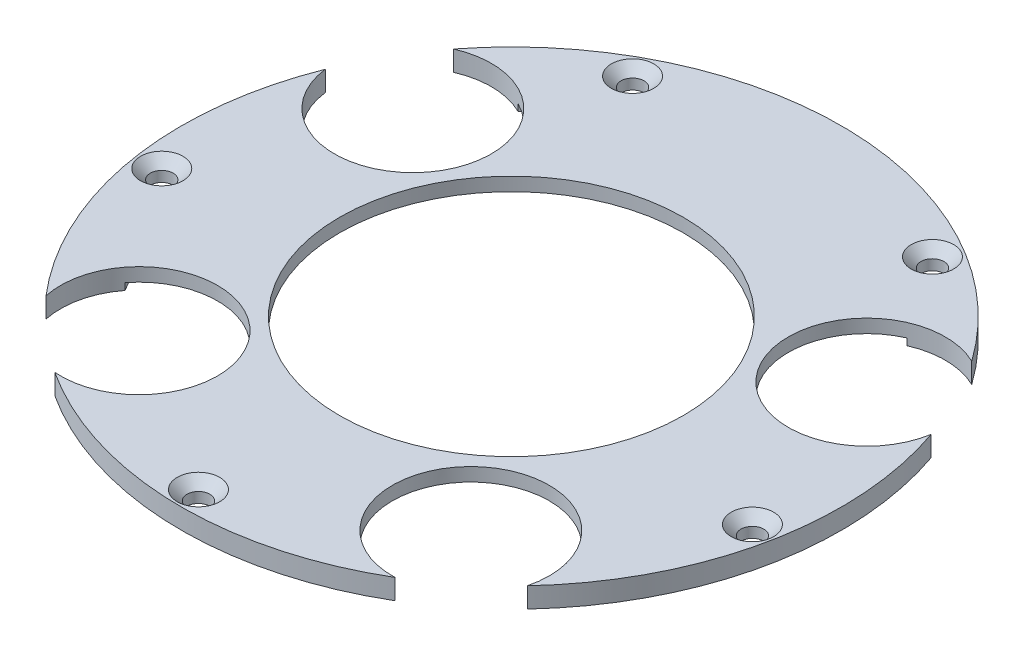
ISO-10303-21;
HEADER;
FILE_DESCRIPTION(('STEP AP214'),'2;1');
FILE_NAME('part.step','',(''),(''),'','','');
FILE_SCHEMA(('AUTOMOTIVE_DESIGN { 1 0 10303 214 1 1 1 1 }'));
ENDSEC;
DATA;
#1=APPLICATION_CONTEXT('core data for automotive mechanical design processes');
#2=APPLICATION_PROTOCOL_DEFINITION('international standard','automotive_design',2000,#1);
#3=PRODUCT_CONTEXT('',#1,'mechanical');
#4=PRODUCT('Part','Part','',(#3));
#5=PRODUCT_RELATED_PRODUCT_CATEGORY('part','',(#4));
#6=PRODUCT_DEFINITION_FORMATION('','',#4);
#7=PRODUCT_DEFINITION_CONTEXT('part definition',#1,'design');
#8=PRODUCT_DEFINITION('design','',#6,#7);
#9=PRODUCT_DEFINITION_SHAPE('','',#8);
#10=(LENGTH_UNIT() NAMED_UNIT(*) SI_UNIT(.MILLI.,.METRE.));
#11=(NAMED_UNIT(*) PLANE_ANGLE_UNIT() SI_UNIT($,.RADIAN.));
#12=(NAMED_UNIT(*) SI_UNIT($,.STERADIAN.) SOLID_ANGLE_UNIT());
#13=UNCERTAINTY_MEASURE_WITH_UNIT(LENGTH_MEASURE(1.E-05),#10,'distance_accuracy_value','');
#14=(GEOMETRIC_REPRESENTATION_CONTEXT(3) GLOBAL_UNCERTAINTY_ASSIGNED_CONTEXT((#13)) GLOBAL_UNIT_ASSIGNED_CONTEXT((#10,
#11,#12)) REPRESENTATION_CONTEXT('',''));
#15=CARTESIAN_POINT('',(0.,0.,0.));
#16=DIRECTION('',(0.,0.,1.));
#17=DIRECTION('',(1.,0.,0.));
#18=AXIS2_PLACEMENT_3D('',#15,#16,#17);
#19=CARTESIAN_POINT('',(12.3758074343673,2.,-7.08786953076596));
#20=DIRECTION('',(0.,1.,0.));
#21=DIRECTION('',(0.,0.,1.));
#22=AXIS2_PLACEMENT_3D('',#19,#20,#21);
#23=PLANE('',#22);
#24=CARTESIAN_POINT('',(3.58837357966304,2.,32.0840779950896));
#25=DIRECTION('',(0.,1.,0.));
#26=DIRECTION('',(0.,0.,1.));
#27=AXIS2_PLACEMENT_3D('',#24,#25,#26);
#28=CIRCLE('',#27,11.6500000000001);
#29=CARTESIAN_POINT('',(2.69423355646016,2.,43.6997145949022));
#30=VERTEX_POINT('',#29);
#31=CARTESIAN_POINT('',(-7.80713671846885,2.,34.5058222105614));
#32=VERTEX_POINT('',#31);
#33=EDGE_CURVE('E164',#30,#32,#28,.T.);
#34=ORIENTED_EDGE('',*,*,#33,.F.);
#35=CARTESIAN_POINT('',(29.3915702540628,2.,2.61136815391197));
#36=DIRECTION('',(0.,1.,0.));
#37=DIRECTION('',(0.,0.,1.));
#38=AXIS2_PLACEMENT_3D('',#35,#36,#37);
#39=CIRCLE('',#38,49.);
#40=CARTESIAN_POINT('',(54.3096021563148,2.,44.802500944089));
#41=VERTEX_POINT('',#40);
#42=EDGE_CURVE('E75',#30,#41,#39,.T.);
#43=ORIENTED_EDGE('',*,*,#42,.T.);
#44=CARTESIAN_POINT('',(53.9123985631486,2.,33.1592741874905));
#45=DIRECTION('',(0.,1.,0.));
#46=DIRECTION('',(0.,0.,1.));
#47=AXIS2_PLACEMENT_3D('',#44,#45,#46);
#48=CIRCLE('',#47,11.6499999999998);
#49=CARTESIAN_POINT('',(65.1940737271688,2.,36.0655270143322));
#50=VERTEX_POINT('',#49);
#51=EDGE_CURVE('E179',#50,#41,#48,.T.);
#52=ORIENTED_EDGE('',*,*,#51,.F.);
#53=CARTESIAN_POINT('',(29.3915702540628,2.,2.61136815391197));
#54=DIRECTION('',(0.,1.,0.));
#55=DIRECTION('',(0.,0.,1.));
#56=AXIS2_PLACEMENT_3D('',#53,#54,#55);
#57=CIRCLE('',#56,49.);
#58=CARTESIAN_POINT('',(75.7086384688879,2.,-13.3801668563126));
#59=VERTEX_POINT('',#58);
#60=EDGE_CURVE('E190',#50,#59,#57,.T.);
#61=ORIENTED_EDGE('',*,*,#60,.T.);
#62=CARTESIAN_POINT('',(64.2205771161356,2.,-15.3158699211986));
#63=DIRECTION('',(0.,1.,0.));
#64=DIRECTION('',(0.,0.,1.));
#65=AXIS2_PLACEMENT_3D('',#62,#63,#64);
#66=CIRCLE('',#65,11.6500000000005);
#67=CARTESIAN_POINT('',(69.3210152727833,2.,-25.7900300598552));
#68=VERTEX_POINT('',#67);
#69=EDGE_CURVE('E257',#68,#59,#66,.T.);
#70=ORIENTED_EDGE('',*,*,#69,.F.);
#71=CARTESIAN_POINT('',(29.3915702540628,2.,2.61136815391197));
#72=DIRECTION('',(0.,1.,0.));
#73=DIRECTION('',(0.,0.,1.));
#74=AXIS2_PLACEMENT_3D('',#71,#72,#73);
#75=CIRCLE('',#74,49.);
#76=CARTESIAN_POINT('',(-9.28837275141119,2.,-27.4695561851651));
#77=VERTEX_POINT('',#76);
#78=EDGE_CURVE('E188',#68,#77,#75,.T.);
#79=ORIENTED_EDGE('',*,*,#78,.T.);
#80=CARTESIAN_POINT('',(-4.6399553853282,2.,-16.7871072154439));
#81=DIRECTION('',(0.,1.,0.));
#82=DIRECTION('',(0.,0.,1.));
#83=AXIS2_PLACEMENT_3D('',#80,#81,#82);
#84=CIRCLE('',#83,11.65);
#85=CARTESIAN_POINT('',(-16.2002099635463,2.,-15.3438421369542));
#86=VERTEX_POINT('',#85);
#87=EDGE_CURVE('E185',#86,#77,#84,.T.);
#88=ORIENTED_EDGE('',*,*,#87,.F.);
#89=CARTESIAN_POINT('',(29.3915702540628,2.,2.61136815391197));
#90=DIRECTION('',(0.,1.,0.));
#91=DIRECTION('',(0.,0.,1.));
#92=AXIS2_PLACEMENT_3D('',#89,#90,#91);
#93=CIRCLE('',#92,49.);
#94=EDGE_CURVE('E176',#86,#32,#93,.T.);
#95=ORIENTED_EDGE('',*,*,#94,.T.);
#96=EDGE_LOOP('',(#34,#43,#52,#61,#70,#79,#88,#95));
#97=FACE_BOUND('',#96,.T.);
#98=CARTESIAN_POINT('',(7.48845699566584,2.,-37.2697505564481));
#99=DIRECTION('',(0.,1.,0.));
#100=DIRECTION('',(0.,0.,1.));
#101=AXIS2_PLACEMENT_3D('',#98,#99,#100);
#102=CIRCLE('',#101,3.15);
#103=CARTESIAN_POINT('',(7.48845699566584,2.,-34.1197505564481));
#104=VERTEX_POINT('',#103);
#105=EDGE_CURVE('E293',#104,#104,#102,.T.);
#106=ORIENTED_EDGE('',*,*,#105,.F.);
#107=EDGE_LOOP('',(#106));
#108=FACE_BOUND('',#107,.T.);
#109=CARTESIAN_POINT('',(52.9780755593794,2.,-36.2978437050078));
#110=DIRECTION('',(0.,1.,0.));
#111=DIRECTION('',(0.,0.,1.));
#112=AXIS2_PLACEMENT_3D('',#109,#110,#111);
#113=CIRCLE('',#112,3.15);
#114=CARTESIAN_POINT('',(52.9780755593794,2.,-33.1478437050078));
#115=VERTEX_POINT('',#114);
#116=EDGE_CURVE('E299',#115,#115,#113,.T.);
#117=ORIENTED_EDGE('',*,*,#116,.F.);
#118=EDGE_LOOP('',(#117));
#119=FACE_BOUND('',#118,.T.);
#120=CARTESIAN_POINT('',(74.0213294435615,2.,11.4676989227681));
#121=DIRECTION('',(0.,1.,0.));
#122=DIRECTION('',(0.,0.,1.));
#123=AXIS2_PLACEMENT_3D('',#120,#121,#122);
#124=CIRCLE('',#123,3.15);
#125=CARTESIAN_POINT('',(74.0213294435615,2.,14.6176989227681));
#126=VERTEX_POINT('',#125);
#127=EDGE_CURVE('E305',#126,#126,#124,.T.);
#128=ORIENTED_EDGE('',*,*,#127,.F.);
#129=EDGE_LOOP('',(#128));
#130=FACE_BOUND('',#129,.T.);
#131=CARTESIAN_POINT('',(28.419663402623,2.,48.100986717625));
#132=DIRECTION('',(0.,1.,0.));
#133=DIRECTION('',(0.,0.,1.));
#134=AXIS2_PLACEMENT_3D('',#131,#132,#133);
#135=CIRCLE('',#134,3.15);
#136=CARTESIAN_POINT('',(28.419663402623,2.,51.250986717625));
#137=VERTEX_POINT('',#136);
#138=EDGE_CURVE('E311',#137,#137,#135,.T.);
#139=ORIENTED_EDGE('',*,*,#138,.F.);
#140=EDGE_LOOP('',(#139));
#141=FACE_BOUND('',#140,.T.);
#142=CARTESIAN_POINT('',(-15.5757286426643,2.,9.55341611775999));
#143=DIRECTION('',(0.,1.,0.));
#144=DIRECTION('',(0.,0.,1.));
#145=AXIS2_PLACEMENT_3D('',#142,#143,#144);
#146=CIRCLE('',#145,3.15);
#147=CARTESIAN_POINT('',(-15.5757286426643,2.,12.70341611776));
#148=VERTEX_POINT('',#147);
#149=EDGE_CURVE('E317',#148,#148,#146,.T.);
#150=ORIENTED_EDGE('',*,*,#149,.F.);
#151=EDGE_LOOP('',(#150));
#152=FACE_BOUND('',#151,.T.);
#153=CARTESIAN_POINT('',(29.3915702540628,2.,2.61136815391197));
#154=DIRECTION('',(0.,1.,0.));
#155=DIRECTION('',(0.,0.,1.));
#156=AXIS2_PLACEMENT_3D('',#153,#154,#155);
#157=CIRCLE('',#156,25.506);
#158=CARTESIAN_POINT('',(29.3915702540628,2.,28.117368153912));
#159=VERTEX_POINT('',#158);
#160=EDGE_CURVE('E220',#159,#159,#157,.T.);
#161=ORIENTED_EDGE('',*,*,#160,.F.);
#162=EDGE_LOOP('',(#161));
#163=FACE_BOUND('',#162,.T.);
#164=ADVANCED_FACE('F53',(#97,#108,#119,#130,#141,#152,#163),#23,.T.);
#165=CARTESIAN_POINT('',(12.3758074343673,0.,-7.08786953076596));
#166=DIRECTION('',(0.,1.,0.));
#167=DIRECTION('',(0.,0.,1.));
#168=AXIS2_PLACEMENT_3D('',#165,#166,#167);
#169=PLANE('',#168);
#170=CARTESIAN_POINT('',(29.3915702540628,0.,2.61136815391197));
#171=DIRECTION('',(0.,1.,0.));
#172=DIRECTION('',(0.,0.,1.));
#173=AXIS2_PLACEMENT_3D('',#170,#171,#172);
#174=CIRCLE('',#173,41.538);
#175=CARTESIAN_POINT('',(45.2852653982641,0.,40.9883912102043));
#176=VERTEX_POINT('',#175);
#177=CARTESIAN_POINT('',(11.8732412512744,0.,40.274527779069));
#178=VERTEX_POINT('',#177);
#179=EDGE_CURVE('E212',#176,#178,#174,.F.);
#180=ORIENTED_EDGE('',*,*,#179,.T.);
#181=CARTESIAN_POINT('',(3.58837357966304,0.,32.0840779950896));
#182=DIRECTION('',(0.,1.,0.));
#183=DIRECTION('',(0.,0.,1.));
#184=AXIS2_PLACEMENT_3D('',#181,#182,#183);
#185=CIRCLE('',#184,11.6500000000001);
#186=CARTESIAN_POINT('',(-5.62536408819743,0.,24.9545942698924));
#187=VERTEX_POINT('',#186);
#188=EDGE_CURVE('E381',#178,#187,#185,.T.);
#189=ORIENTED_EDGE('',*,*,#188,.T.);
#190=CARTESIAN_POINT('',(29.3915702540628,0.,2.61136815391197));
#191=DIRECTION('',(0.,1.,0.));
#192=DIRECTION('',(0.,0.,1.));
#193=AXIS2_PLACEMENT_3D('',#190,#191,#192);
#194=CIRCLE('',#193,41.538);
#195=CARTESIAN_POINT('',(-11.0111469101583,0.,-7.03362483457429));
#196=VERTEX_POINT('',#195);
#197=EDGE_CURVE('E217',#187,#196,#194,.F.);
#198=ORIENTED_EDGE('',*,*,#197,.T.);
#199=CARTESIAN_POINT('',(-4.6399553853282,0.,-16.7871072154439));
#200=DIRECTION('',(0.,1.,0.));
#201=DIRECTION('',(0.,0.,1.));
#202=AXIS2_PLACEMENT_3D('',#199,#200,#201);
#203=CIRCLE('',#202,11.65);
#204=CARTESIAN_POINT('',(0.506160677268403,0.,-27.2389008160794));
#205=VERTEX_POINT('',#204);
#206=EDGE_CURVE('E282',#196,#205,#203,.T.);
#207=ORIENTED_EDGE('',*,*,#206,.T.);
#208=CARTESIAN_POINT('',(29.3915702540628,0.,2.61136815391197));
#209=DIRECTION('',(0.,1.,0.));
#210=DIRECTION('',(0.,0.,1.));
#211=AXIS2_PLACEMENT_3D('',#208,#209,#210);
#212=CIRCLE('',#211,41.538);
#213=CARTESIAN_POINT('',(59.5255682205722,0.,-25.9779237322892));
#214=VERTEX_POINT('',#213);
#215=EDGE_CURVE('E200',#205,#214,#212,.F.);
#216=ORIENTED_EDGE('',*,*,#215,.T.);
#217=CARTESIAN_POINT('',(64.2205771161356,0.,-15.3158699211986));
#218=DIRECTION('',(0.,1.,0.));
#219=DIRECTION('',(0.,0.,1.));
#220=AXIS2_PLACEMENT_3D('',#217,#218,#219);
#221=CIRCLE('',#220,11.6500000000005);
#222=CARTESIAN_POINT('',(70.1693694045691,0.,-5.29916535786617));
#223=VERTEX_POINT('',#222);
#224=EDGE_CURVE('E265',#214,#223,#221,.T.);
#225=ORIENTED_EDGE('',*,*,#224,.T.);
#226=CARTESIAN_POINT('',(29.3915702540628,0.,2.61136815391197));
#227=DIRECTION('',(0.,1.,0.));
#228=DIRECTION('',(0.,0.,1.));
#229=AXIS2_PLACEMENT_3D('',#226,#227,#228);
#230=CIRCLE('',#229,41.538);
#231=CARTESIAN_POINT('',(63.4222387037189,0.,26.4298284078743));
#232=VERTEX_POINT('',#231);
#233=EDGE_CURVE('E206',#223,#232,#230,.F.);
#234=ORIENTED_EDGE('',*,*,#233,.T.);
#235=CARTESIAN_POINT('',(53.9123985631486,0.,33.1592741874905));
#236=DIRECTION('',(0.,1.,0.));
#237=DIRECTION('',(0.,0.,1.));
#238=AXIS2_PLACEMENT_3D('',#235,#236,#237);
#239=CIRCLE('',#238,11.6499999999998);
#240=EDGE_CURVE('E244',#232,#176,#239,.T.);
#241=ORIENTED_EDGE('',*,*,#240,.T.);
#242=EDGE_LOOP('',(#180,#189,#198,#207,#216,#225,#234,#241));
#243=FACE_BOUND('',#242,.T.);
#244=CARTESIAN_POINT('',(29.3915702540628,0.,2.61136815391197));
#245=DIRECTION('',(0.,1.,0.));
#246=DIRECTION('',(0.,0.,1.));
#247=AXIS2_PLACEMENT_3D('',#244,#245,#246);
#248=CIRCLE('',#247,25.506);
#249=CARTESIAN_POINT('',(29.3915702540628,0.,28.117368153912));
#250=VERTEX_POINT('',#249);
#251=EDGE_CURVE('E219',#250,#250,#248,.T.);
#252=ORIENTED_EDGE('',*,*,#251,.T.);
#253=EDGE_LOOP('',(#252));
#254=FACE_BOUND('',#253,.T.);
#255=ADVANCED_FACE('F55',(#243,#254),#169,.F.);
#256=CARTESIAN_POINT('',(29.3915702540628,2.,2.61136815391197));
#257=DIRECTION('',(0.,-1.,0.));
#258=DIRECTION('',(0.,0.,-1.));
#259=AXIS2_PLACEMENT_3D('',#256,#257,#258);
#260=CYLINDRICAL_SURFACE('',#259,25.506);
#261=ORIENTED_EDGE('',*,*,#160,.T.);
#262=EDGE_LOOP('',(#261));
#263=FACE_BOUND('',#262,.T.);
#264=ORIENTED_EDGE('',*,*,#251,.F.);
#265=EDGE_LOOP('',(#264));
#266=FACE_BOUND('',#265,.T.);
#267=ADVANCED_FACE('F397',(#263,#266),#260,.F.);
#268=CARTESIAN_POINT('',(29.3915702540628,-1.,2.61136815391197));
#269=DIRECTION('',(0.,1.,0.));
#270=DIRECTION('',(0.,0.,1.));
#271=AXIS2_PLACEMENT_3D('',#268,#269,#270);
#272=CYLINDRICAL_SURFACE('',#271,41.538);
#273=DIRECTION('',(0.,1.,0.));
#274=VECTOR('',#273,1.);
#275=CARTESIAN_POINT('',(-5.62536408819744,-3.,24.9545942698924));
#276=LINE('',#275,#274);
#277=CARTESIAN_POINT('',(-5.62536408819744,-1.,24.9545942698924));
#278=VERTEX_POINT('',#277);
#279=EDGE_CURVE('E379',#278,#187,#276,.T.);
#280=ORIENTED_EDGE('',*,*,#279,.F.);
#281=CARTESIAN_POINT('',(29.3915702540628,-1.,2.61136815391197));
#282=DIRECTION('',(0.,-1.,0.));
#283=DIRECTION('',(0.,0.,1.));
#284=AXIS2_PLACEMENT_3D('',#281,#282,#283);
#285=CIRCLE('',#284,41.538);
#286=CARTESIAN_POINT('',(-11.0111469101583,-1.,-7.03362483457429));
#287=VERTEX_POINT('',#286);
#288=EDGE_CURVE('E215',#278,#287,#285,.T.);
#289=ORIENTED_EDGE('',*,*,#288,.T.);
#290=DIRECTION('',(0.,1.,0.));
#291=VECTOR('',#290,1.);
#292=CARTESIAN_POINT('',(-11.0111469101583,-3.,-7.03362483457429));
#293=LINE('',#292,#291);
#294=EDGE_CURVE('E279',#196,#287,#293,.F.);
#295=ORIENTED_EDGE('',*,*,#294,.F.);
#296=ORIENTED_EDGE('',*,*,#197,.F.);
#297=EDGE_LOOP('',(#280,#289,#295,#296));
#298=FACE_BOUND('',#297,.T.);
#299=ADVANCED_FACE('F395',(#298),#272,.F.);
#300=CARTESIAN_POINT('',(16.4899719168629,-1.,17.3477230745007));
#301=DIRECTION('',(0.,1.,0.));
#302=DIRECTION('',(0.,0.,1.));
#303=AXIS2_PLACEMENT_3D('',#300,#301,#302);
#304=PLANE('',#303);
#305=CARTESIAN_POINT('',(-15.5757286426643,-1.,9.55341611775999));
#306=DIRECTION('',(0.,1.,0.));
#307=DIRECTION('',(0.,0.,1.));
#308=AXIS2_PLACEMENT_3D('',#305,#306,#307);
#309=CIRCLE('',#308,1.7);
#310=CARTESIAN_POINT('',(-15.5757286426643,-1.,11.25341611776));
#311=VERTEX_POINT('',#310);
#312=EDGE_CURVE('E323',#311,#311,#309,.T.);
#313=ORIENTED_EDGE('',*,*,#312,.T.);
#314=EDGE_LOOP('',(#313));
#315=FACE_BOUND('',#314,.T.);
#316=ORIENTED_EDGE('',*,*,#288,.F.);
#317=CARTESIAN_POINT('',(3.58837357966304,-1.,32.0840779950896));
#318=DIRECTION('',(0.,1.,0.));
#319=DIRECTION('',(0.,0.,1.));
#320=AXIS2_PLACEMENT_3D('',#317,#318,#319);
#321=CIRCLE('',#320,11.6500000000001);
#322=CARTESIAN_POINT('',(-7.80713671846884,-1.,34.5058222105614));
#323=VERTEX_POINT('',#322);
#324=EDGE_CURVE('E180',#278,#323,#321,.T.);
#325=ORIENTED_EDGE('',*,*,#324,.T.);
#326=CARTESIAN_POINT('',(29.3915702540628,-1.,2.61136815391197));
#327=DIRECTION('',(0.,1.,0.));
#328=DIRECTION('',(0.,0.,1.));
#329=AXIS2_PLACEMENT_3D('',#326,#327,#328);
#330=CIRCLE('',#329,49.);
#331=CARTESIAN_POINT('',(-16.2002099635463,-1.,-15.3438421369542));
#332=VERTEX_POINT('',#331);
#333=EDGE_CURVE('E178',#332,#323,#330,.T.);
#334=ORIENTED_EDGE('',*,*,#333,.F.);
#335=CARTESIAN_POINT('',(-4.6399553853282,-1.,-16.7871072154439));
#336=DIRECTION('',(0.,1.,0.));
#337=DIRECTION('',(0.,0.,1.));
#338=AXIS2_PLACEMENT_3D('',#335,#336,#337);
#339=CIRCLE('',#338,11.65);
#340=EDGE_CURVE('E276',#332,#287,#339,.T.);
#341=ORIENTED_EDGE('',*,*,#340,.T.);
#342=EDGE_LOOP('',(#316,#325,#334,#341));
#343=FACE_BOUND('',#342,.T.);
#344=ADVANCED_FACE('F377',(#315,#343),#304,.F.);
#345=CARTESIAN_POINT('',(29.3915702540628,-1.,2.61136815391197));
#346=DIRECTION('',(0.,1.,0.));
#347=DIRECTION('',(0.,0.,1.));
#348=AXIS2_PLACEMENT_3D('',#345,#346,#347);
#349=CYLINDRICAL_SURFACE('',#348,41.538);
#350=DIRECTION('',(0.,1.,0.));
#351=VECTOR('',#350,1.);
#352=CARTESIAN_POINT('',(11.8732412512744,-3.,40.274527779069));
#353=LINE('',#352,#351);
#354=CARTESIAN_POINT('',(11.8732412512744,-1.,40.274527779069));
#355=VERTEX_POINT('',#354);
#356=EDGE_CURVE('E386',#178,#355,#353,.F.);
#357=ORIENTED_EDGE('',*,*,#356,.F.);
#358=ORIENTED_EDGE('',*,*,#179,.F.);
#359=DIRECTION('',(0.,1.,0.));
#360=VECTOR('',#359,1.);
#361=CARTESIAN_POINT('',(45.2852653982641,-3.,40.9883912102043));
#362=LINE('',#361,#360);
#363=CARTESIAN_POINT('',(45.2852653982642,-1.,40.9883912102042));
#364=VERTEX_POINT('',#363);
#365=EDGE_CURVE('E242',#364,#176,#362,.T.);
#366=ORIENTED_EDGE('',*,*,#365,.F.);
#367=CARTESIAN_POINT('',(29.3915702540628,-1.,2.61136815391197));
#368=DIRECTION('',(0.,-1.,0.));
#369=DIRECTION('',(0.,0.,1.));
#370=AXIS2_PLACEMENT_3D('',#367,#368,#369);
#371=CIRCLE('',#370,41.538);
#372=EDGE_CURVE('E209',#364,#355,#371,.T.);
#373=ORIENTED_EDGE('',*,*,#372,.T.);
#374=EDGE_LOOP('',(#357,#358,#366,#373));
#375=FACE_BOUND('',#374,.T.);
#376=ADVANCED_FACE('F390',(#375),#349,.F.);
#377=CARTESIAN_POINT('',(41.6519844086057,-1.,17.8853211707012));
#378=DIRECTION('',(0.,1.,0.));
#379=DIRECTION('',(0.,0.,1.));
#380=AXIS2_PLACEMENT_3D('',#377,#378,#379);
#381=PLANE('',#380);
#382=CARTESIAN_POINT('',(28.419663402623,-1.,48.100986717625));
#383=DIRECTION('',(0.,1.,0.));
#384=DIRECTION('',(0.,0.,1.));
#385=AXIS2_PLACEMENT_3D('',#382,#383,#384);
#386=CIRCLE('',#385,1.7);
#387=CARTESIAN_POINT('',(28.419663402623,-1.,49.800986717625));
#388=VERTEX_POINT('',#387);
#389=EDGE_CURVE('E335',#388,#388,#386,.T.);
#390=ORIENTED_EDGE('',*,*,#389,.T.);
#391=EDGE_LOOP('',(#390));
#392=FACE_BOUND('',#391,.T.);
#393=CARTESIAN_POINT('',(29.3915702540628,-1.,2.61136815391197));
#394=DIRECTION('',(0.,1.,0.));
#395=DIRECTION('',(0.,0.,1.));
#396=AXIS2_PLACEMENT_3D('',#393,#394,#395);
#397=CIRCLE('',#396,49.);
#398=CARTESIAN_POINT('',(2.69423355646015,-1.,43.6997145949022));
#399=VERTEX_POINT('',#398);
#400=CARTESIAN_POINT('',(54.3096021563148,-1.,44.802500944089));
#401=VERTEX_POINT('',#400);
#402=EDGE_CURVE('E241',#399,#401,#397,.T.);
#403=ORIENTED_EDGE('',*,*,#402,.F.);
#404=CARTESIAN_POINT('',(3.58837357966304,-1.,32.0840779950896));
#405=DIRECTION('',(0.,1.,0.));
#406=DIRECTION('',(0.,0.,1.));
#407=AXIS2_PLACEMENT_3D('',#404,#405,#406);
#408=CIRCLE('',#407,11.6500000000001);
#409=EDGE_CURVE('E67',#399,#355,#408,.T.);
#410=ORIENTED_EDGE('',*,*,#409,.T.);
#411=ORIENTED_EDGE('',*,*,#372,.F.);
#412=CARTESIAN_POINT('',(53.9123985631486,-1.,33.1592741874905));
#413=DIRECTION('',(0.,1.,0.));
#414=DIRECTION('',(0.,0.,1.));
#415=AXIS2_PLACEMENT_3D('',#412,#413,#414);
#416=CIRCLE('',#415,11.6499999999998);
#417=EDGE_CURVE('E234',#364,#401,#416,.T.);
#418=ORIENTED_EDGE('',*,*,#417,.T.);
#419=EDGE_LOOP('',(#403,#410,#411,#418));
#420=FACE_BOUND('',#419,.T.);
#421=ADVANCED_FACE('F240',(#392,#420),#381,.F.);
#422=CARTESIAN_POINT('',(29.3915702540628,-1.,2.61136815391197));
#423=DIRECTION('',(0.,1.,0.));
#424=DIRECTION('',(0.,0.,1.));
#425=AXIS2_PLACEMENT_3D('',#422,#423,#424);
#426=CYLINDRICAL_SURFACE('',#425,41.538);
#427=DIRECTION('',(0.,1.,0.));
#428=VECTOR('',#427,1.);
#429=CARTESIAN_POINT('',(63.4222387037189,-3.,26.4298284078743));
#430=LINE('',#429,#428);
#431=CARTESIAN_POINT('',(63.4222387037189,-1.,26.4298284078743));
#432=VERTEX_POINT('',#431);
#433=EDGE_CURVE('E250',#232,#432,#430,.F.);
#434=ORIENTED_EDGE('',*,*,#433,.F.);
#435=ORIENTED_EDGE('',*,*,#233,.F.);
#436=DIRECTION('',(0.,1.,0.));
#437=VECTOR('',#436,1.);
#438=CARTESIAN_POINT('',(70.1693694045691,-3.,-5.29916535786617));
#439=LINE('',#438,#437);
#440=CARTESIAN_POINT('',(70.1693694045691,-1.,-5.29916535786618));
#441=VERTEX_POINT('',#440);
#442=EDGE_CURVE('E263',#441,#223,#439,.T.);
#443=ORIENTED_EDGE('',*,*,#442,.F.);
#444=CARTESIAN_POINT('',(29.3915702540628,-1.,2.61136815391197));
#445=DIRECTION('',(0.,-1.,0.));
#446=DIRECTION('',(0.,0.,1.));
#447=AXIS2_PLACEMENT_3D('',#444,#445,#446);
#448=CIRCLE('',#447,41.538);
#449=EDGE_CURVE('E203',#441,#432,#448,.T.);
#450=ORIENTED_EDGE('',*,*,#449,.T.);
#451=EDGE_LOOP('',(#434,#435,#443,#450));
#452=FACE_BOUND('',#451,.T.);
#453=ADVANCED_FACE('F357',(#452),#426,.F.);
#454=CARTESIAN_POINT('',(46.8060736850992,-1.,-6.35225088364329));
#455=DIRECTION('',(0.,1.,0.));
#456=DIRECTION('',(0.,0.,1.));
#457=AXIS2_PLACEMENT_3D('',#454,#455,#456);
#458=PLANE('',#457);
#459=CARTESIAN_POINT('',(74.0213294435615,-1.,11.4676989227681));
#460=DIRECTION('',(0.,1.,0.));
#461=DIRECTION('',(0.,0.,1.));
#462=AXIS2_PLACEMENT_3D('',#459,#460,#461);
#463=CIRCLE('',#462,1.70000000000001);
#464=CARTESIAN_POINT('',(74.0213294435615,-1.,13.1676989227681));
#465=VERTEX_POINT('',#464);
#466=EDGE_CURVE('E332',#465,#465,#463,.T.);
#467=ORIENTED_EDGE('',*,*,#466,.T.);
#468=EDGE_LOOP('',(#467));
#469=FACE_BOUND('',#468,.T.);
#470=CARTESIAN_POINT('',(29.3915702540628,-1.,2.61136815391197));
#471=DIRECTION('',(0.,1.,0.));
#472=DIRECTION('',(0.,0.,1.));
#473=AXIS2_PLACEMENT_3D('',#470,#471,#472);
#474=CIRCLE('',#473,49.);
#475=CARTESIAN_POINT('',(65.1940737271688,-1.,36.0655270143322));
#476=VERTEX_POINT('',#475);
#477=CARTESIAN_POINT('',(75.7086384688879,-1.,-13.3801668563126));
#478=VERTEX_POINT('',#477);
#479=EDGE_CURVE('E186',#476,#478,#474,.T.);
#480=ORIENTED_EDGE('',*,*,#479,.F.);
#481=CARTESIAN_POINT('',(53.9123985631486,-1.,33.1592741874905));
#482=DIRECTION('',(0.,1.,0.));
#483=DIRECTION('',(0.,0.,1.));
#484=AXIS2_PLACEMENT_3D('',#481,#482,#483);
#485=CIRCLE('',#484,11.6499999999998);
#486=EDGE_CURVE('E252',#476,#432,#485,.T.);
#487=ORIENTED_EDGE('',*,*,#486,.T.);
#488=ORIENTED_EDGE('',*,*,#449,.F.);
#489=CARTESIAN_POINT('',(64.2205771161356,-1.,-15.3158699211986));
#490=DIRECTION('',(0.,1.,0.));
#491=DIRECTION('',(0.,0.,1.));
#492=AXIS2_PLACEMENT_3D('',#489,#490,#491);
#493=CIRCLE('',#492,11.6500000000005);
#494=EDGE_CURVE('E260',#441,#478,#493,.T.);
#495=ORIENTED_EDGE('',*,*,#494,.T.);
#496=EDGE_LOOP('',(#480,#487,#488,#495));
#497=FACE_BOUND('',#496,.T.);
#498=ADVANCED_FACE('F351',(#469,#497),#458,.F.);
#499=CARTESIAN_POINT('',(29.3915702540628,-1.,2.61136815391197));
#500=DIRECTION('',(0.,1.,0.));
#501=DIRECTION('',(0.,0.,1.));
#502=AXIS2_PLACEMENT_3D('',#499,#500,#501);
#503=CYLINDRICAL_SURFACE('',#502,41.538);
#504=DIRECTION('',(0.,1.,0.));
#505=VECTOR('',#504,1.);
#506=CARTESIAN_POINT('',(59.5255682205722,-3.,-25.9779237322892));
#507=LINE('',#506,#505);
#508=CARTESIAN_POINT('',(59.5255682205722,-1.,-25.9779237322892));
#509=VERTEX_POINT('',#508);
#510=EDGE_CURVE('E268',#214,#509,#507,.F.);
#511=ORIENTED_EDGE('',*,*,#510,.F.);
#512=ORIENTED_EDGE('',*,*,#215,.F.);
#513=DIRECTION('',(0.,1.,0.));
#514=VECTOR('',#513,1.);
#515=CARTESIAN_POINT('',(0.506160677268401,-3.,-27.2389008160794));
#516=LINE('',#515,#514);
#517=CARTESIAN_POINT('',(0.506160677268401,-1.,-27.2389008160794));
#518=VERTEX_POINT('',#517);
#519=EDGE_CURVE('E285',#518,#205,#516,.T.);
#520=ORIENTED_EDGE('',*,*,#519,.F.);
#521=CARTESIAN_POINT('',(29.3915702540628,-1.,2.61136815391197));
#522=DIRECTION('',(0.,-1.,0.));
#523=DIRECTION('',(0.,0.,1.));
#524=AXIS2_PLACEMENT_3D('',#521,#522,#523);
#525=CIRCLE('',#524,41.538);
#526=EDGE_CURVE('E196',#518,#509,#525,.T.);
#527=ORIENTED_EDGE('',*,*,#526,.T.);
#528=EDGE_LOOP('',(#511,#512,#520,#527));
#529=FACE_BOUND('',#528,.T.);
#530=ADVANCED_FACE('F364',(#529),#503,.F.);
#531=CARTESIAN_POINT('',(12.3758074343673,-1.,-7.08786953076596));
#532=DIRECTION('',(0.,1.,0.));
#533=DIRECTION('',(0.,0.,1.));
#534=AXIS2_PLACEMENT_3D('',#531,#532,#533);
#535=PLANE('',#534);
#536=CARTESIAN_POINT('',(7.48845699566584,-1.,-37.2697505564481));
#537=DIRECTION('',(0.,1.,0.));
#538=DIRECTION('',(0.,0.,1.));
#539=AXIS2_PLACEMENT_3D('',#536,#537,#538);
#540=CIRCLE('',#539,1.7);
#541=CARTESIAN_POINT('',(7.48845699566584,-1.,-35.5697505564481));
#542=VERTEX_POINT('',#541);
#543=EDGE_CURVE('E326',#542,#542,#540,.T.);
#544=ORIENTED_EDGE('',*,*,#543,.T.);
#545=EDGE_LOOP('',(#544));
#546=FACE_BOUND('',#545,.T.);
#547=CARTESIAN_POINT('',(52.9780755593794,-1.,-36.2978437050078));
#548=DIRECTION('',(0.,1.,0.));
#549=DIRECTION('',(0.,0.,1.));
#550=AXIS2_PLACEMENT_3D('',#547,#548,#549);
#551=CIRCLE('',#550,1.7);
#552=CARTESIAN_POINT('',(52.9780755593794,-1.,-34.5978437050078));
#553=VERTEX_POINT('',#552);
#554=EDGE_CURVE('E329',#553,#553,#551,.T.);
#555=ORIENTED_EDGE('',*,*,#554,.T.);
#556=EDGE_LOOP('',(#555));
#557=FACE_BOUND('',#556,.T.);
#558=CARTESIAN_POINT('',(29.3915702540628,-1.,2.61136815391197));
#559=DIRECTION('',(0.,1.,0.));
#560=DIRECTION('',(0.,0.,1.));
#561=AXIS2_PLACEMENT_3D('',#558,#559,#560);
#562=CIRCLE('',#561,49.);
#563=CARTESIAN_POINT('',(69.3210152727833,-1.,-25.7900300598552));
#564=VERTEX_POINT('',#563);
#565=CARTESIAN_POINT('',(-9.28837275141118,-1.,-27.4695561851652));
#566=VERTEX_POINT('',#565);
#567=EDGE_CURVE('E194',#564,#566,#562,.T.);
#568=ORIENTED_EDGE('',*,*,#567,.F.);
#569=CARTESIAN_POINT('',(64.2205771161356,-1.,-15.3158699211986));
#570=DIRECTION('',(0.,1.,0.));
#571=DIRECTION('',(0.,0.,1.));
#572=AXIS2_PLACEMENT_3D('',#569,#570,#571);
#573=CIRCLE('',#572,11.6500000000005);
#574=EDGE_CURVE('E270',#564,#509,#573,.T.);
#575=ORIENTED_EDGE('',*,*,#574,.T.);
#576=ORIENTED_EDGE('',*,*,#526,.F.);
#577=CARTESIAN_POINT('',(-4.6399553853282,-1.,-16.7871072154439));
#578=DIRECTION('',(0.,1.,0.));
#579=DIRECTION('',(0.,0.,1.));
#580=AXIS2_PLACEMENT_3D('',#577,#578,#579);
#581=CIRCLE('',#580,11.65);
#582=EDGE_CURVE('E287',#518,#566,#581,.T.);
#583=ORIENTED_EDGE('',*,*,#582,.T.);
#584=EDGE_LOOP('',(#568,#575,#576,#583));
#585=FACE_BOUND('',#584,.T.);
#586=ADVANCED_FACE('F369',(#546,#557,#585),#535,.F.);
#587=CARTESIAN_POINT('',(29.3915702540628,-1.,2.61136815391197));
#588=DIRECTION('',(0.,1.,0.));
#589=DIRECTION('',(0.,0.,1.));
#590=AXIS2_PLACEMENT_3D('',#587,#588,#589);
#591=CYLINDRICAL_SURFACE('',#590,49.);
#592=DIRECTION('',(0.,1.,0.));
#593=VECTOR('',#592,1.);
#594=CARTESIAN_POINT('',(69.3210152727833,-3.,-25.7900300598552));
#595=LINE('',#594,#593);
#596=EDGE_CURVE('E273',#564,#68,#595,.T.);
#597=ORIENTED_EDGE('',*,*,#596,.F.);
#598=ORIENTED_EDGE('',*,*,#567,.T.);
#599=DIRECTION('',(0.,1.,0.));
#600=VECTOR('',#599,1.);
#601=CARTESIAN_POINT('',(-9.28837275141117,-3.,-27.4695561851651));
#602=LINE('',#601,#600);
#603=EDGE_CURVE('E290',#77,#566,#602,.F.);
#604=ORIENTED_EDGE('',*,*,#603,.F.);
#605=ORIENTED_EDGE('',*,*,#78,.F.);
#606=EDGE_LOOP('',(#597,#598,#604,#605));
#607=FACE_BOUND('',#606,.T.);
#608=ADVANCED_FACE('F371',(#607),#591,.T.);
#609=CARTESIAN_POINT('',(29.3915702540628,-1.,2.61136815391197));
#610=DIRECTION('',(0.,1.,0.));
#611=DIRECTION('',(0.,0.,1.));
#612=AXIS2_PLACEMENT_3D('',#609,#610,#611);
#613=CYLINDRICAL_SURFACE('',#612,49.);
#614=DIRECTION('',(0.,1.,0.));
#615=VECTOR('',#614,1.);
#616=CARTESIAN_POINT('',(-7.80713671846885,-3.,34.5058222105614));
#617=LINE('',#616,#615);
#618=EDGE_CURVE('E167',#32,#323,#617,.F.);
#619=ORIENTED_EDGE('',*,*,#618,.F.);
#620=ORIENTED_EDGE('',*,*,#94,.F.);
#621=DIRECTION('',(0.,1.,0.));
#622=VECTOR('',#621,1.);
#623=CARTESIAN_POINT('',(-16.2002099635463,-3.,-15.3438421369541));
#624=LINE('',#623,#622);
#625=EDGE_CURVE('E223',#332,#86,#624,.T.);
#626=ORIENTED_EDGE('',*,*,#625,.F.);
#627=ORIENTED_EDGE('',*,*,#333,.T.);
#628=EDGE_LOOP('',(#619,#620,#626,#627));
#629=FACE_BOUND('',#628,.T.);
#630=ADVANCED_FACE('F174',(#629),#613,.T.);
#631=CARTESIAN_POINT('',(29.3915702540628,-1.,2.61136815391197));
#632=DIRECTION('',(0.,1.,0.));
#633=DIRECTION('',(0.,0.,1.));
#634=AXIS2_PLACEMENT_3D('',#631,#632,#633);
#635=CYLINDRICAL_SURFACE('',#634,49.);
#636=DIRECTION('',(0.,1.,0.));
#637=VECTOR('',#636,1.);
#638=CARTESIAN_POINT('',(65.1940737271688,-3.,36.0655270143322));
#639=LINE('',#638,#637);
#640=EDGE_CURVE('E255',#476,#50,#639,.T.);
#641=ORIENTED_EDGE('',*,*,#640,.F.);
#642=ORIENTED_EDGE('',*,*,#479,.T.);
#643=DIRECTION('',(0.,1.,0.));
#644=VECTOR('',#643,1.);
#645=CARTESIAN_POINT('',(75.7086384688879,-3.,-13.3801668563126));
#646=LINE('',#645,#644);
#647=EDGE_CURVE('E227',#59,#478,#646,.F.);
#648=ORIENTED_EDGE('',*,*,#647,.F.);
#649=ORIENTED_EDGE('',*,*,#60,.F.);
#650=EDGE_LOOP('',(#641,#642,#648,#649));
#651=FACE_BOUND('',#650,.T.);
#652=ADVANCED_FACE('F348',(#651),#635,.T.);
#653=CARTESIAN_POINT('',(29.3915702540628,-1.,2.61136815391197));
#654=DIRECTION('',(0.,1.,0.));
#655=DIRECTION('',(0.,0.,1.));
#656=AXIS2_PLACEMENT_3D('',#653,#654,#655);
#657=CYLINDRICAL_SURFACE('',#656,49.);
#658=DIRECTION('',(0.,1.,0.));
#659=VECTOR('',#658,1.);
#660=CARTESIAN_POINT('',(2.69423355646015,-3.,43.6997145949022));
#661=LINE('',#660,#659);
#662=EDGE_CURVE('E13',#399,#30,#661,.T.);
#663=ORIENTED_EDGE('',*,*,#662,.F.);
#664=ORIENTED_EDGE('',*,*,#402,.T.);
#665=DIRECTION('',(0.,1.,0.));
#666=VECTOR('',#665,1.);
#667=CARTESIAN_POINT('',(54.3096021563148,-3.,44.802500944089));
#668=LINE('',#667,#666);
#669=EDGE_CURVE('E61',#41,#401,#668,.F.);
#670=ORIENTED_EDGE('',*,*,#669,.F.);
#671=ORIENTED_EDGE('',*,*,#42,.F.);
#672=EDGE_LOOP('',(#663,#664,#670,#671));
#673=FACE_BOUND('',#672,.T.);
#674=ADVANCED_FACE('F429',(#673),#657,.T.);
#675=CARTESIAN_POINT('',(28.419663402623,-1.,48.100986717625));
#676=DIRECTION('',(0.,1.,0.));
#677=DIRECTION('',(0.,0.,1.));
#678=AXIS2_PLACEMENT_3D('',#675,#676,#677);
#679=CYLINDRICAL_SURFACE('',#678,1.7);
#680=CARTESIAN_POINT('',(28.419663402623,0.549999999999999,48.100986717625));
#681=DIRECTION('',(0.,1.,0.));
#682=DIRECTION('',(0.,0.,1.));
#683=AXIS2_PLACEMENT_3D('',#680,#681,#682);
#684=CIRCLE('',#683,1.7);
#685=CARTESIAN_POINT('',(28.419663402623,0.549999999999999,49.800986717625));
#686=VERTEX_POINT('',#685);
#687=EDGE_CURVE('E314',#686,#686,#684,.T.);
#688=ORIENTED_EDGE('',*,*,#687,.T.);
#689=EDGE_LOOP('',(#688));
#690=FACE_BOUND('',#689,.T.);
#691=ORIENTED_EDGE('',*,*,#389,.F.);
#692=EDGE_LOOP('',(#691));
#693=FACE_BOUND('',#692,.T.);
#694=ADVANCED_FACE('F423',(#690,#693),#679,.F.);
#695=CARTESIAN_POINT('',(74.0213294435615,-1.,11.4676989227681));
#696=DIRECTION('',(0.,1.,0.));
#697=DIRECTION('',(0.,0.,1.));
#698=AXIS2_PLACEMENT_3D('',#695,#696,#697);
#699=CYLINDRICAL_SURFACE('',#698,1.70000000000001);
#700=CARTESIAN_POINT('',(74.0213294435615,0.549999999999999,11.4676989227681));
#701=DIRECTION('',(0.,1.,0.));
#702=DIRECTION('',(0.,0.,1.));
#703=AXIS2_PLACEMENT_3D('',#700,#701,#702);
#704=CIRCLE('',#703,1.69999999999999);
#705=CARTESIAN_POINT('',(74.0213294435615,0.549999999999999,13.1676989227681));
#706=VERTEX_POINT('',#705);
#707=EDGE_CURVE('E308',#706,#706,#704,.T.);
#708=ORIENTED_EDGE('',*,*,#707,.T.);
#709=EDGE_LOOP('',(#708));
#710=FACE_BOUND('',#709,.T.);
#711=ORIENTED_EDGE('',*,*,#466,.F.);
#712=EDGE_LOOP('',(#711));
#713=FACE_BOUND('',#712,.T.);
#714=ADVANCED_FACE('F428',(#710,#713),#699,.F.);
#715=CARTESIAN_POINT('',(52.9780755593794,-1.,-36.2978437050078));
#716=DIRECTION('',(0.,1.,0.));
#717=DIRECTION('',(0.,0.,1.));
#718=AXIS2_PLACEMENT_3D('',#715,#716,#717);
#719=CYLINDRICAL_SURFACE('',#718,1.7);
#720=CARTESIAN_POINT('',(52.9780755593794,0.549999999999999,-36.2978437050078));
#721=DIRECTION('',(0.,1.,0.));
#722=DIRECTION('',(0.,0.,1.));
#723=AXIS2_PLACEMENT_3D('',#720,#721,#722);
#724=CIRCLE('',#723,1.7);
#725=CARTESIAN_POINT('',(52.9780755593794,0.549999999999999,-34.5978437050078));
#726=VERTEX_POINT('',#725);
#727=EDGE_CURVE('E302',#726,#726,#724,.T.);
#728=ORIENTED_EDGE('',*,*,#727,.T.);
#729=EDGE_LOOP('',(#728));
#730=FACE_BOUND('',#729,.T.);
#731=ORIENTED_EDGE('',*,*,#554,.F.);
#732=EDGE_LOOP('',(#731));
#733=FACE_BOUND('',#732,.T.);
#734=ADVANCED_FACE('F441',(#730,#733),#719,.F.);
#735=CARTESIAN_POINT('',(7.48845699566584,-1.,-37.2697505564481));
#736=DIRECTION('',(0.,1.,0.));
#737=DIRECTION('',(0.,0.,1.));
#738=AXIS2_PLACEMENT_3D('',#735,#736,#737);
#739=CYLINDRICAL_SURFACE('',#738,1.7);
#740=CARTESIAN_POINT('',(7.48845699566584,0.549999999999999,-37.2697505564481));
#741=DIRECTION('',(0.,1.,0.));
#742=DIRECTION('',(0.,0.,1.));
#743=AXIS2_PLACEMENT_3D('',#740,#741,#742);
#744=CIRCLE('',#743,1.7);
#745=CARTESIAN_POINT('',(7.48845699566584,0.549999999999999,-35.5697505564481));
#746=VERTEX_POINT('',#745);
#747=EDGE_CURVE('E296',#746,#746,#744,.T.);
#748=ORIENTED_EDGE('',*,*,#747,.T.);
#749=EDGE_LOOP('',(#748));
#750=FACE_BOUND('',#749,.T.);
#751=ORIENTED_EDGE('',*,*,#543,.F.);
#752=EDGE_LOOP('',(#751));
#753=FACE_BOUND('',#752,.T.);
#754=ADVANCED_FACE('F451',(#750,#753),#739,.F.);
#755=CARTESIAN_POINT('',(-15.5757286426643,-1.,9.55341611775999));
#756=DIRECTION('',(0.,1.,0.));
#757=DIRECTION('',(0.,0.,1.));
#758=AXIS2_PLACEMENT_3D('',#755,#756,#757);
#759=CYLINDRICAL_SURFACE('',#758,1.7);
#760=CARTESIAN_POINT('',(-15.5757286426643,0.549999999999999,9.55341611775999));
#761=DIRECTION('',(0.,1.,0.));
#762=DIRECTION('',(0.,0.,1.));
#763=AXIS2_PLACEMENT_3D('',#760,#761,#762);
#764=CIRCLE('',#763,1.7);
#765=CARTESIAN_POINT('',(-15.5757286426643,0.549999999999999,11.25341611776));
#766=VERTEX_POINT('',#765);
#767=EDGE_CURVE('E320',#766,#766,#764,.T.);
#768=ORIENTED_EDGE('',*,*,#767,.T.);
#769=EDGE_LOOP('',(#768));
#770=FACE_BOUND('',#769,.T.);
#771=ORIENTED_EDGE('',*,*,#312,.F.);
#772=EDGE_LOOP('',(#771));
#773=FACE_BOUND('',#772,.T.);
#774=ADVANCED_FACE('F461',(#770,#773),#759,.F.);
#775=CARTESIAN_POINT('',(-15.5757286426643,2.,9.55341611775999));
#776=DIRECTION('',(0.,1.,0.));
#777=DIRECTION('',(0.,0.,1.));
#778=AXIS2_PLACEMENT_3D('',#775,#776,#777);
#779=CONICAL_SURFACE('',#778,3.15,0.785398163397448);
#780=ORIENTED_EDGE('',*,*,#767,.F.);
#781=EDGE_LOOP('',(#780));
#782=FACE_BOUND('',#781,.T.);
#783=ORIENTED_EDGE('',*,*,#149,.T.);
#784=EDGE_LOOP('',(#783));
#785=FACE_BOUND('',#784,.T.);
#786=ADVANCED_FACE('F471',(#782,#785),#779,.F.);
#787=CARTESIAN_POINT('',(28.419663402623,2.,48.100986717625));
#788=DIRECTION('',(0.,1.,0.));
#789=DIRECTION('',(0.,0.,1.));
#790=AXIS2_PLACEMENT_3D('',#787,#788,#789);
#791=CONICAL_SURFACE('',#790,3.15,0.785398163397447);
#792=ORIENTED_EDGE('',*,*,#687,.F.);
#793=EDGE_LOOP('',(#792));
#794=FACE_BOUND('',#793,.T.);
#795=ORIENTED_EDGE('',*,*,#138,.T.);
#796=EDGE_LOOP('',(#795));
#797=FACE_BOUND('',#796,.T.);
#798=ADVANCED_FACE('F481',(#794,#797),#791,.F.);
#799=CARTESIAN_POINT('',(74.0213294435615,2.,11.4676989227681));
#800=DIRECTION('',(0.,1.,0.));
#801=DIRECTION('',(0.,0.,1.));
#802=AXIS2_PLACEMENT_3D('',#799,#800,#801);
#803=CONICAL_SURFACE('',#802,3.15,0.78539816339745);
#804=ORIENTED_EDGE('',*,*,#707,.F.);
#805=EDGE_LOOP('',(#804));
#806=FACE_BOUND('',#805,.T.);
#807=ORIENTED_EDGE('',*,*,#127,.T.);
#808=EDGE_LOOP('',(#807));
#809=FACE_BOUND('',#808,.T.);
#810=ADVANCED_FACE('F491',(#806,#809),#803,.F.);
#811=CARTESIAN_POINT('',(52.9780755593794,2.,-36.2978437050078));
#812=DIRECTION('',(0.,1.,0.));
#813=DIRECTION('',(0.,0.,1.));
#814=AXIS2_PLACEMENT_3D('',#811,#812,#813);
#815=CONICAL_SURFACE('',#814,3.15,0.785398163397448);
#816=ORIENTED_EDGE('',*,*,#727,.F.);
#817=EDGE_LOOP('',(#816));
#818=FACE_BOUND('',#817,.T.);
#819=ORIENTED_EDGE('',*,*,#116,.T.);
#820=EDGE_LOOP('',(#819));
#821=FACE_BOUND('',#820,.T.);
#822=ADVANCED_FACE('F501',(#818,#821),#815,.F.);
#823=CARTESIAN_POINT('',(7.48845699566584,2.,-37.2697505564481));
#824=DIRECTION('',(0.,1.,0.));
#825=DIRECTION('',(0.,0.,1.));
#826=AXIS2_PLACEMENT_3D('',#823,#824,#825);
#827=CONICAL_SURFACE('',#826,3.15,0.785398163397448);
#828=ORIENTED_EDGE('',*,*,#747,.F.);
#829=EDGE_LOOP('',(#828));
#830=FACE_BOUND('',#829,.T.);
#831=ORIENTED_EDGE('',*,*,#105,.T.);
#832=EDGE_LOOP('',(#831));
#833=FACE_BOUND('',#832,.T.);
#834=ADVANCED_FACE('F511',(#830,#833),#827,.F.);
#835=CARTESIAN_POINT('',(-4.6399553853282,-8.,-16.7871072154439));
#836=DIRECTION('',(0.,1.,0.));
#837=DIRECTION('',(0.,0.,1.));
#838=AXIS2_PLACEMENT_3D('',#835,#836,#837);
#839=CYLINDRICAL_SURFACE('',#838,11.65);
#840=ORIENTED_EDGE('',*,*,#603,.T.);
#841=ORIENTED_EDGE('',*,*,#582,.F.);
#842=ORIENTED_EDGE('',*,*,#519,.T.);
#843=ORIENTED_EDGE('',*,*,#206,.F.);
#844=ORIENTED_EDGE('',*,*,#294,.T.);
#845=ORIENTED_EDGE('',*,*,#340,.F.);
#846=ORIENTED_EDGE('',*,*,#625,.T.);
#847=ORIENTED_EDGE('',*,*,#87,.T.);
#848=EDGE_LOOP('',(#840,#841,#842,#843,#844,#845,#846,#847));
#849=FACE_BOUND('',#848,.T.);
#850=ADVANCED_FACE('F374',(#849),#839,.F.);
#851=CARTESIAN_POINT('',(64.2205771161356,-8.,-15.3158699211986));
#852=DIRECTION('',(0.,1.,0.));
#853=DIRECTION('',(0.,0.,1.));
#854=AXIS2_PLACEMENT_3D('',#851,#852,#853);
#855=CYLINDRICAL_SURFACE('',#854,11.6500000000005);
#856=ORIENTED_EDGE('',*,*,#596,.T.);
#857=ORIENTED_EDGE('',*,*,#69,.T.);
#858=ORIENTED_EDGE('',*,*,#647,.T.);
#859=ORIENTED_EDGE('',*,*,#494,.F.);
#860=ORIENTED_EDGE('',*,*,#442,.T.);
#861=ORIENTED_EDGE('',*,*,#224,.F.);
#862=ORIENTED_EDGE('',*,*,#510,.T.);
#863=ORIENTED_EDGE('',*,*,#574,.F.);
#864=EDGE_LOOP('',(#856,#857,#858,#859,#860,#861,#862,#863));
#865=FACE_BOUND('',#864,.T.);
#866=ADVANCED_FACE('F346',(#865),#855,.F.);
#867=CARTESIAN_POINT('',(53.9123985631486,-8.,33.1592741874905));
#868=DIRECTION('',(0.,1.,0.));
#869=DIRECTION('',(0.,0.,1.));
#870=AXIS2_PLACEMENT_3D('',#867,#868,#869);
#871=CYLINDRICAL_SURFACE('',#870,11.6499999999998);
#872=ORIENTED_EDGE('',*,*,#640,.T.);
#873=ORIENTED_EDGE('',*,*,#51,.T.);
#874=ORIENTED_EDGE('',*,*,#669,.T.);
#875=ORIENTED_EDGE('',*,*,#417,.F.);
#876=ORIENTED_EDGE('',*,*,#365,.T.);
#877=ORIENTED_EDGE('',*,*,#240,.F.);
#878=ORIENTED_EDGE('',*,*,#433,.T.);
#879=ORIENTED_EDGE('',*,*,#486,.F.);
#880=EDGE_LOOP('',(#872,#873,#874,#875,#876,#877,#878,#879));
#881=FACE_BOUND('',#880,.T.);
#882=ADVANCED_FACE('F233',(#881),#871,.F.);
#883=CARTESIAN_POINT('',(3.58837357966304,-8.,32.0840779950896));
#884=DIRECTION('',(0.,1.,0.));
#885=DIRECTION('',(0.,0.,1.));
#886=AXIS2_PLACEMENT_3D('',#883,#884,#885);
#887=CYLINDRICAL_SURFACE('',#886,11.6500000000001);
#888=ORIENTED_EDGE('',*,*,#618,.T.);
#889=ORIENTED_EDGE('',*,*,#324,.F.);
#890=ORIENTED_EDGE('',*,*,#279,.T.);
#891=ORIENTED_EDGE('',*,*,#188,.F.);
#892=ORIENTED_EDGE('',*,*,#356,.T.);
#893=ORIENTED_EDGE('',*,*,#409,.F.);
#894=ORIENTED_EDGE('',*,*,#662,.T.);
#895=ORIENTED_EDGE('',*,*,#33,.T.);
#896=EDGE_LOOP('',(#888,#889,#890,#891,#892,#893,#894,#895));
#897=FACE_BOUND('',#896,.T.);
#898=ADVANCED_FACE('F166',(#897),#887,.F.);
#899=CLOSED_SHELL('',(#164,#255,#267,#299,#344,#376,#421,#453,#498,#530,#586,#608,#630,#652,
#674,#694,#714,#734,#754,#774,#786,#798,#810,#822,#834,#850,#866,#882,#898));
#900=MANIFOLD_SOLID_BREP('B2',#899);
#901=ADVANCED_BREP_SHAPE_REPRESENTATION('',(#18,#900),#14);
#902=SHAPE_DEFINITION_REPRESENTATION(#9,#901);
ENDSEC;
END-ISO-10303-21;
